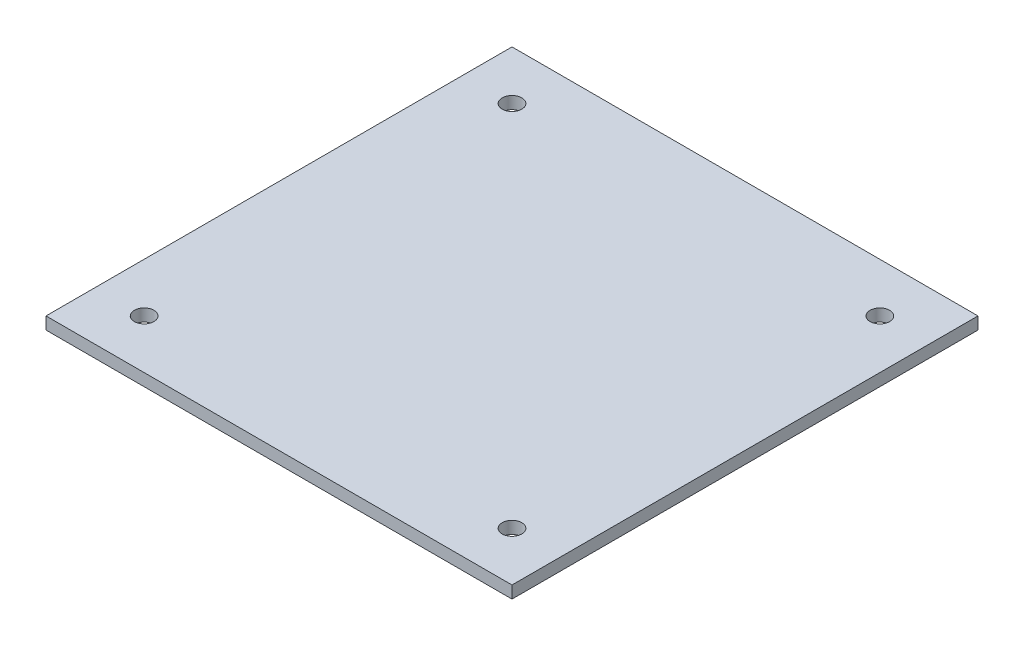
ISO-10303-21;
HEADER;
FILE_DESCRIPTION(('STEP AP214'),'2;1');
FILE_NAME('part.step','',(''),(''),'','','');
FILE_SCHEMA(('AUTOMOTIVE_DESIGN { 1 0 10303 214 1 1 1 1 }'));
ENDSEC;
DATA;
#1=APPLICATION_CONTEXT('core data for automotive mechanical design processes');
#2=APPLICATION_PROTOCOL_DEFINITION('international standard','automotive_design',2000,#1);
#3=PRODUCT_CONTEXT('',#1,'mechanical');
#4=PRODUCT('Part','Part','',(#3));
#5=PRODUCT_RELATED_PRODUCT_CATEGORY('part','',(#4));
#6=PRODUCT_DEFINITION_FORMATION('','',#4);
#7=PRODUCT_DEFINITION_CONTEXT('part definition',#1,'design');
#8=PRODUCT_DEFINITION('design','',#6,#7);
#9=PRODUCT_DEFINITION_SHAPE('','',#8);
#10=(LENGTH_UNIT() NAMED_UNIT(*) SI_UNIT(.MILLI.,.METRE.));
#11=(NAMED_UNIT(*) PLANE_ANGLE_UNIT() SI_UNIT($,.RADIAN.));
#12=(NAMED_UNIT(*) SI_UNIT($,.STERADIAN.) SOLID_ANGLE_UNIT());
#13=UNCERTAINTY_MEASURE_WITH_UNIT(LENGTH_MEASURE(1.E-05),#10,'distance_accuracy_value','');
#14=(GEOMETRIC_REPRESENTATION_CONTEXT(3) GLOBAL_UNCERTAINTY_ASSIGNED_CONTEXT((#13)) GLOBAL_UNIT_ASSIGNED_CONTEXT((#10,
#11,#12)) REPRESENTATION_CONTEXT('',''));
#15=CARTESIAN_POINT('',(0.,0.,0.));
#16=DIRECTION('',(0.,0.,1.));
#17=DIRECTION('',(1.,0.,0.));
#18=AXIS2_PLACEMENT_3D('',#15,#16,#17);
#19=CARTESIAN_POINT('',(30.,0.,30.));
#20=DIRECTION('',(0.,1.,0.));
#21=DIRECTION('',(0.,0.,1.));
#22=AXIS2_PLACEMENT_3D('',#19,#20,#21);
#23=CYLINDRICAL_SURFACE('',#22,1.6);
#24=CARTESIAN_POINT('',(30.,0.,30.));
#25=DIRECTION('',(0.,1.,0.));
#26=DIRECTION('',(0.,0.,1.));
#27=AXIS2_PLACEMENT_3D('',#24,#25,#26);
#28=CIRCLE('',#27,1.6);
#29=CARTESIAN_POINT('',(30.,0.,31.6));
#30=VERTEX_POINT('',#29);
#31=EDGE_CURVE('E43',#30,#30,#28,.T.);
#32=ORIENTED_EDGE('',*,*,#31,.F.);
#33=EDGE_LOOP('',(#32));
#34=FACE_BOUND('',#33,.T.);
#35=CARTESIAN_POINT('',(30.,2.,30.));
#36=DIRECTION('',(0.,1.,0.));
#37=DIRECTION('',(0.,0.,1.));
#38=AXIS2_PLACEMENT_3D('',#35,#36,#37);
#39=CIRCLE('',#38,1.6);
#40=CARTESIAN_POINT('',(30.,2.,31.6));
#41=VERTEX_POINT('',#40);
#42=EDGE_CURVE('E11',#41,#41,#39,.T.);
#43=ORIENTED_EDGE('',*,*,#42,.T.);
#44=EDGE_LOOP('',(#43));
#45=FACE_BOUND('',#44,.T.);
#46=ADVANCED_FACE('F35',(#34,#45),#23,.F.);
#47=CARTESIAN_POINT('',(-30.,0.,30.));
#48=DIRECTION('',(0.,1.,0.));
#49=DIRECTION('',(0.,0.,1.));
#50=AXIS2_PLACEMENT_3D('',#47,#48,#49);
#51=CYLINDRICAL_SURFACE('',#50,1.6);
#52=CARTESIAN_POINT('',(-30.,0.,30.));
#53=DIRECTION('',(0.,1.,0.));
#54=DIRECTION('',(0.,0.,1.));
#55=AXIS2_PLACEMENT_3D('',#52,#53,#54);
#56=CIRCLE('',#55,1.6);
#57=CARTESIAN_POINT('',(-30.,0.,31.6));
#58=VERTEX_POINT('',#57);
#59=EDGE_CURVE('E113',#58,#58,#56,.T.);
#60=ORIENTED_EDGE('',*,*,#59,.F.);
#61=EDGE_LOOP('',(#60));
#62=FACE_BOUND('',#61,.T.);
#63=CARTESIAN_POINT('',(-30.,2.,30.));
#64=DIRECTION('',(0.,1.,0.));
#65=DIRECTION('',(0.,0.,1.));
#66=AXIS2_PLACEMENT_3D('',#63,#64,#65);
#67=CIRCLE('',#66,1.6);
#68=CARTESIAN_POINT('',(-30.,2.,31.6));
#69=VERTEX_POINT('',#68);
#70=EDGE_CURVE('E116',#69,#69,#67,.T.);
#71=ORIENTED_EDGE('',*,*,#70,.T.);
#72=EDGE_LOOP('',(#71));
#73=FACE_BOUND('',#72,.T.);
#74=ADVANCED_FACE('F125',(#62,#73),#51,.F.);
#75=CARTESIAN_POINT('',(-38.,2.,38.));
#76=DIRECTION('',(1.,0.,0.));
#77=DIRECTION('',(0.,0.,-1.));
#78=AXIS2_PLACEMENT_3D('',#75,#76,#77);
#79=PLANE('',#78);
#80=DIRECTION('',(0.,0.,1.));
#81=VECTOR('',#80,1.);
#82=CARTESIAN_POINT('',(-38.,0.,38.));
#83=LINE('',#82,#81);
#84=CARTESIAN_POINT('',(-38.,0.,-38.));
#85=VERTEX_POINT('',#84);
#86=CARTESIAN_POINT('',(-38.,0.,38.));
#87=VERTEX_POINT('',#86);
#88=EDGE_CURVE('E103',#85,#87,#83,.T.);
#89=ORIENTED_EDGE('',*,*,#88,.T.);
#90=DIRECTION('',(0.,-1.,0.));
#91=VECTOR('',#90,1.);
#92=CARTESIAN_POINT('',(-38.,2.,38.));
#93=LINE('',#92,#91);
#94=CARTESIAN_POINT('',(-38.,2.,38.));
#95=VERTEX_POINT('',#94);
#96=EDGE_CURVE('E94',#95,#87,#93,.T.);
#97=ORIENTED_EDGE('',*,*,#96,.F.);
#98=DIRECTION('',(0.,0.,1.));
#99=VECTOR('',#98,1.);
#100=CARTESIAN_POINT('',(-38.,2.,38.));
#101=LINE('',#100,#99);
#102=CARTESIAN_POINT('',(-38.,2.,-38.));
#103=VERTEX_POINT('',#102);
#104=EDGE_CURVE('E88',#103,#95,#101,.T.);
#105=ORIENTED_EDGE('',*,*,#104,.F.);
#106=DIRECTION('',(0.,-1.,0.));
#107=VECTOR('',#106,1.);
#108=CARTESIAN_POINT('',(-38.,2.,-38.));
#109=LINE('',#108,#107);
#110=EDGE_CURVE('E99',#103,#85,#109,.T.);
#111=ORIENTED_EDGE('',*,*,#110,.T.);
#112=EDGE_LOOP('',(#89,#97,#105,#111));
#113=FACE_BOUND('',#112,.T.);
#114=ADVANCED_FACE('F149',(#113),#79,.F.);
#115=CARTESIAN_POINT('',(38.,2.,38.));
#116=DIRECTION('',(0.,0.,-1.));
#117=DIRECTION('',(-1.,0.,0.));
#118=AXIS2_PLACEMENT_3D('',#115,#116,#117);
#119=PLANE('',#118);
#120=DIRECTION('',(1.,0.,0.));
#121=VECTOR('',#120,1.);
#122=CARTESIAN_POINT('',(38.,0.,38.));
#123=LINE('',#122,#121);
#124=CARTESIAN_POINT('',(38.,0.,38.));
#125=VERTEX_POINT('',#124);
#126=EDGE_CURVE('E93',#87,#125,#123,.T.);
#127=ORIENTED_EDGE('',*,*,#126,.T.);
#128=DIRECTION('',(0.,-1.,0.));
#129=VECTOR('',#128,1.);
#130=CARTESIAN_POINT('',(38.,2.,38.));
#131=LINE('',#130,#129);
#132=CARTESIAN_POINT('',(38.,2.,38.));
#133=VERTEX_POINT('',#132);
#134=EDGE_CURVE('E91',#133,#125,#131,.T.);
#135=ORIENTED_EDGE('',*,*,#134,.F.);
#136=DIRECTION('',(1.,0.,0.));
#137=VECTOR('',#136,1.);
#138=CARTESIAN_POINT('',(38.,2.,38.));
#139=LINE('',#138,#137);
#140=EDGE_CURVE('E82',#95,#133,#139,.T.);
#141=ORIENTED_EDGE('',*,*,#140,.F.);
#142=ORIENTED_EDGE('',*,*,#96,.T.);
#143=EDGE_LOOP('',(#127,#135,#141,#142));
#144=FACE_BOUND('',#143,.T.);
#145=ADVANCED_FACE('F92',(#144),#119,.F.);
#146=CARTESIAN_POINT('',(38.,2.,38.));
#147=DIRECTION('',(-1.,0.,0.));
#148=DIRECTION('',(0.,0.,1.));
#149=AXIS2_PLACEMENT_3D('',#146,#147,#148);
#150=PLANE('',#149);
#151=DIRECTION('',(0.,0.,-1.));
#152=VECTOR('',#151,1.);
#153=CARTESIAN_POINT('',(38.,0.,38.));
#154=LINE('',#153,#152);
#155=CARTESIAN_POINT('',(38.,0.,-38.));
#156=VERTEX_POINT('',#155);
#157=EDGE_CURVE('E68',#125,#156,#154,.T.);
#158=ORIENTED_EDGE('',*,*,#157,.T.);
#159=DIRECTION('',(0.,-1.,0.));
#160=VECTOR('',#159,1.);
#161=CARTESIAN_POINT('',(38.,2.,-38.));
#162=LINE('',#161,#160);
#163=CARTESIAN_POINT('',(38.,2.,-38.));
#164=VERTEX_POINT('',#163);
#165=EDGE_CURVE('E95',#164,#156,#162,.T.);
#166=ORIENTED_EDGE('',*,*,#165,.F.);
#167=DIRECTION('',(0.,0.,-1.));
#168=VECTOR('',#167,1.);
#169=CARTESIAN_POINT('',(38.,2.,38.));
#170=LINE('',#169,#168);
#171=EDGE_CURVE('E86',#133,#164,#170,.T.);
#172=ORIENTED_EDGE('',*,*,#171,.F.);
#173=ORIENTED_EDGE('',*,*,#134,.T.);
#174=EDGE_LOOP('',(#158,#166,#172,#173));
#175=FACE_BOUND('',#174,.T.);
#176=ADVANCED_FACE('F97',(#175),#150,.F.);
#177=CARTESIAN_POINT('',(38.,2.,-38.));
#178=DIRECTION('',(0.,0.,1.));
#179=DIRECTION('',(1.,0.,0.));
#180=AXIS2_PLACEMENT_3D('',#177,#178,#179);
#181=PLANE('',#180);
#182=DIRECTION('',(-1.,0.,0.));
#183=VECTOR('',#182,1.);
#184=CARTESIAN_POINT('',(38.,0.,-38.));
#185=LINE('',#184,#183);
#186=EDGE_CURVE('E74',#156,#85,#185,.T.);
#187=ORIENTED_EDGE('',*,*,#186,.T.);
#188=ORIENTED_EDGE('',*,*,#110,.F.);
#189=DIRECTION('',(-1.,0.,0.));
#190=VECTOR('',#189,1.);
#191=CARTESIAN_POINT('',(38.,2.,-38.));
#192=LINE('',#191,#190);
#193=EDGE_CURVE('E51',#164,#103,#192,.T.);
#194=ORIENTED_EDGE('',*,*,#193,.F.);
#195=ORIENTED_EDGE('',*,*,#165,.T.);
#196=EDGE_LOOP('',(#187,#188,#194,#195));
#197=FACE_BOUND('',#196,.T.);
#198=ADVANCED_FACE('F129',(#197),#181,.F.);
#199=CARTESIAN_POINT('',(0.,2.,0.));
#200=DIRECTION('',(0.,1.,0.));
#201=DIRECTION('',(0.,0.,1.));
#202=AXIS2_PLACEMENT_3D('',#199,#200,#201);
#203=PLANE('',#202);
#204=CARTESIAN_POINT('',(30.,2.,-30.));
#205=DIRECTION('',(0.,1.,0.));
#206=DIRECTION('',(0.,0.,1.));
#207=AXIS2_PLACEMENT_3D('',#204,#205,#206);
#208=CIRCLE('',#207,1.6);
#209=CARTESIAN_POINT('',(30.,2.,-28.4));
#210=VERTEX_POINT('',#209);
#211=EDGE_CURVE('E220',#210,#210,#208,.T.);
#212=ORIENTED_EDGE('',*,*,#211,.F.);
#213=EDGE_LOOP('',(#212));
#214=FACE_BOUND('',#213,.T.);
#215=CARTESIAN_POINT('',(-30.,2.,-30.));
#216=DIRECTION('',(0.,1.,0.));
#217=DIRECTION('',(0.,0.,1.));
#218=AXIS2_PLACEMENT_3D('',#215,#216,#217);
#219=CIRCLE('',#218,1.6);
#220=CARTESIAN_POINT('',(-30.,2.,-28.4));
#221=VERTEX_POINT('',#220);
#222=EDGE_CURVE('E221',#221,#221,#219,.T.);
#223=ORIENTED_EDGE('',*,*,#222,.F.);
#224=EDGE_LOOP('',(#223));
#225=FACE_BOUND('',#224,.T.);
#226=ORIENTED_EDGE('',*,*,#104,.T.);
#227=ORIENTED_EDGE('',*,*,#140,.T.);
#228=ORIENTED_EDGE('',*,*,#171,.T.);
#229=ORIENTED_EDGE('',*,*,#193,.T.);
#230=EDGE_LOOP('',(#226,#227,#228,#229));
#231=FACE_BOUND('',#230,.T.);
#232=ORIENTED_EDGE('',*,*,#70,.F.);
#233=EDGE_LOOP('',(#232));
#234=FACE_BOUND('',#233,.T.);
#235=ORIENTED_EDGE('',*,*,#42,.F.);
#236=EDGE_LOOP('',(#235));
#237=FACE_BOUND('',#236,.T.);
#238=ADVANCED_FACE('F83',(#214,#225,#231,#234,#237),#203,.T.);
#239=CARTESIAN_POINT('',(0.,0.,0.));
#240=DIRECTION('',(0.,1.,0.));
#241=DIRECTION('',(0.,0.,1.));
#242=AXIS2_PLACEMENT_3D('',#239,#240,#241);
#243=PLANE('',#242);
#244=CARTESIAN_POINT('',(30.,0.,-30.));
#245=DIRECTION('',(0.,1.,0.));
#246=DIRECTION('',(0.,0.,1.));
#247=AXIS2_PLACEMENT_3D('',#244,#245,#246);
#248=CIRCLE('',#247,1.6);
#249=CARTESIAN_POINT('',(30.,0.,-28.4));
#250=VERTEX_POINT('',#249);
#251=EDGE_CURVE('E218',#250,#250,#248,.T.);
#252=ORIENTED_EDGE('',*,*,#251,.T.);
#253=EDGE_LOOP('',(#252));
#254=FACE_BOUND('',#253,.T.);
#255=CARTESIAN_POINT('',(-30.,0.,-30.));
#256=DIRECTION('',(0.,1.,0.));
#257=DIRECTION('',(0.,0.,1.));
#258=AXIS2_PLACEMENT_3D('',#255,#256,#257);
#259=CIRCLE('',#258,1.6);
#260=CARTESIAN_POINT('',(-30.,0.,-28.4));
#261=VERTEX_POINT('',#260);
#262=EDGE_CURVE('E106',#261,#261,#259,.T.);
#263=ORIENTED_EDGE('',*,*,#262,.T.);
#264=EDGE_LOOP('',(#263));
#265=FACE_BOUND('',#264,.T.);
#266=ORIENTED_EDGE('',*,*,#88,.F.);
#267=ORIENTED_EDGE('',*,*,#186,.F.);
#268=ORIENTED_EDGE('',*,*,#157,.F.);
#269=ORIENTED_EDGE('',*,*,#126,.F.);
#270=EDGE_LOOP('',(#266,#267,#268,#269));
#271=FACE_BOUND('',#270,.T.);
#272=ORIENTED_EDGE('',*,*,#59,.T.);
#273=EDGE_LOOP('',(#272));
#274=FACE_BOUND('',#273,.T.);
#275=ORIENTED_EDGE('',*,*,#31,.T.);
#276=EDGE_LOOP('',(#275));
#277=FACE_BOUND('',#276,.T.);
#278=ADVANCED_FACE('F121',(#254,#265,#271,#274,#277),#243,.F.);
#279=CARTESIAN_POINT('',(-30.,0.,-30.));
#280=DIRECTION('',(0.,1.,0.));
#281=DIRECTION('',(0.,0.,1.));
#282=AXIS2_PLACEMENT_3D('',#279,#280,#281);
#283=CYLINDRICAL_SURFACE('',#282,1.6);
#284=ORIENTED_EDGE('',*,*,#262,.F.);
#285=EDGE_LOOP('',(#284));
#286=FACE_BOUND('',#285,.T.);
#287=ORIENTED_EDGE('',*,*,#222,.T.);
#288=EDGE_LOOP('',(#287));
#289=FACE_BOUND('',#288,.T.);
#290=ADVANCED_FACE('F136',(#286,#289),#283,.F.);
#291=CARTESIAN_POINT('',(30.,0.,-30.));
#292=DIRECTION('',(0.,1.,0.));
#293=DIRECTION('',(0.,0.,1.));
#294=AXIS2_PLACEMENT_3D('',#291,#292,#293);
#295=CYLINDRICAL_SURFACE('',#294,1.6);
#296=ORIENTED_EDGE('',*,*,#251,.F.);
#297=EDGE_LOOP('',(#296));
#298=FACE_BOUND('',#297,.T.);
#299=ORIENTED_EDGE('',*,*,#211,.T.);
#300=EDGE_LOOP('',(#299));
#301=FACE_BOUND('',#300,.T.);
#302=ADVANCED_FACE('F187',(#298,#301),#295,.F.);
#303=CLOSED_SHELL('',(#46,#74,#114,#145,#176,#198,#238,#278,#290,#302));
#304=MANIFOLD_SOLID_BREP('B2',#303);
#305=ADVANCED_BREP_SHAPE_REPRESENTATION('',(#18,#304),#14);
#306=SHAPE_DEFINITION_REPRESENTATION(#9,#305);
ENDSEC;
END-ISO-10303-21;
